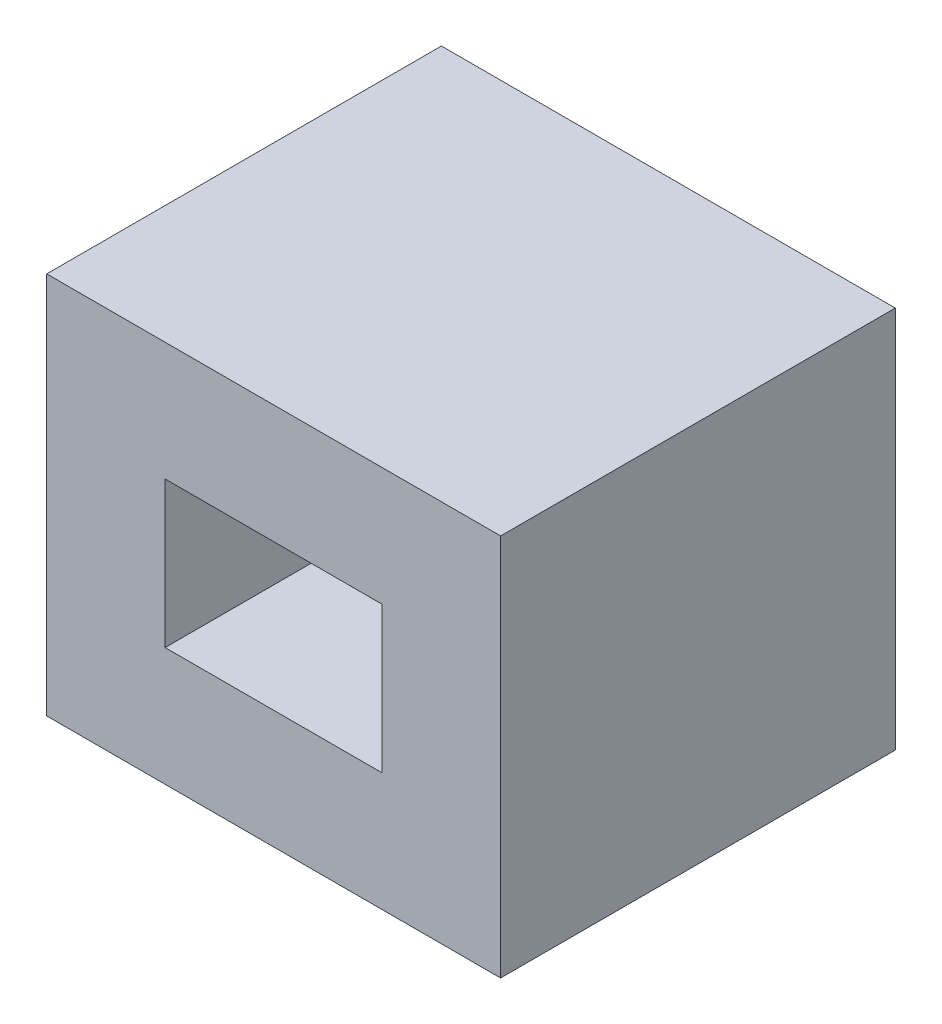
ISO-10303-21;
HEADER;
FILE_DESCRIPTION(('STEP AP214'),'2;1');
FILE_NAME('part.step','',(''),(''),'','','');
FILE_SCHEMA(('AUTOMOTIVE_DESIGN { 1 0 10303 214 1 1 1 1 }'));
ENDSEC;
DATA;
#1=APPLICATION_CONTEXT('core data for automotive mechanical design processes');
#2=APPLICATION_PROTOCOL_DEFINITION('international standard','automotive_design',2000,#1);
#3=PRODUCT_CONTEXT('',#1,'mechanical');
#4=PRODUCT('Part','Part','',(#3));
#5=PRODUCT_RELATED_PRODUCT_CATEGORY('part','',(#4));
#6=PRODUCT_DEFINITION_FORMATION('','',#4);
#7=PRODUCT_DEFINITION_CONTEXT('part definition',#1,'design');
#8=PRODUCT_DEFINITION('design','',#6,#7);
#9=PRODUCT_DEFINITION_SHAPE('','',#8);
#10=(LENGTH_UNIT() NAMED_UNIT(*) SI_UNIT(.MILLI.,.METRE.));
#11=(NAMED_UNIT(*) PLANE_ANGLE_UNIT() SI_UNIT($,.RADIAN.));
#12=(NAMED_UNIT(*) SI_UNIT($,.STERADIAN.) SOLID_ANGLE_UNIT());
#13=UNCERTAINTY_MEASURE_WITH_UNIT(LENGTH_MEASURE(1.E-05),#10,'distance_accuracy_value','');
#14=(GEOMETRIC_REPRESENTATION_CONTEXT(3) GLOBAL_UNCERTAINTY_ASSIGNED_CONTEXT((#13)) GLOBAL_UNIT_ASSIGNED_CONTEXT((#10,
#11,#12)) REPRESENTATION_CONTEXT('',''));
#15=CARTESIAN_POINT('',(0.,0.,0.));
#16=DIRECTION('',(0.,0.,1.));
#17=DIRECTION('',(1.,0.,0.));
#18=AXIS2_PLACEMENT_3D('',#15,#16,#17);
#19=CARTESIAN_POINT('',(0.,0.,10.));
#20=DIRECTION('',(0.,0.,1.));
#21=DIRECTION('',(1.,0.,0.));
#22=AXIS2_PLACEMENT_3D('',#19,#20,#21);
#23=PLANE('',#22);
#24=DIRECTION('',(0.,-1.,0.));
#25=VECTOR('',#24,1.);
#26=CARTESIAN_POINT('',(-5.75,4.85,10.));
#27=LINE('',#26,#25);
#28=CARTESIAN_POINT('',(-5.75,4.85,10.));
#29=VERTEX_POINT('',#28);
#30=CARTESIAN_POINT('',(-5.75,-4.85,10.));
#31=VERTEX_POINT('',#30);
#32=EDGE_CURVE('E134',#29,#31,#27,.T.);
#33=ORIENTED_EDGE('',*,*,#32,.T.);
#34=DIRECTION('',(1.,0.,0.));
#35=VECTOR('',#34,1.);
#36=CARTESIAN_POINT('',(-5.75,-4.85,10.));
#37=LINE('',#36,#35);
#38=CARTESIAN_POINT('',(5.75,-4.85,10.));
#39=VERTEX_POINT('',#38);
#40=EDGE_CURVE('E137',#31,#39,#37,.T.);
#41=ORIENTED_EDGE('',*,*,#40,.T.);
#42=DIRECTION('',(0.,1.,0.));
#43=VECTOR('',#42,1.);
#44=CARTESIAN_POINT('',(5.75,4.85,10.));
#45=LINE('',#44,#43);
#46=CARTESIAN_POINT('',(5.75,4.85,10.));
#47=VERTEX_POINT('',#46);
#48=EDGE_CURVE('E140',#39,#47,#45,.T.);
#49=ORIENTED_EDGE('',*,*,#48,.T.);
#50=DIRECTION('',(-1.,0.,0.));
#51=VECTOR('',#50,1.);
#52=CARTESIAN_POINT('',(-5.75,4.85,10.));
#53=LINE('',#52,#51);
#54=EDGE_CURVE('E142',#47,#29,#53,.T.);
#55=ORIENTED_EDGE('',*,*,#54,.T.);
#56=EDGE_LOOP('',(#33,#41,#49,#55));
#57=FACE_BOUND('',#56,.T.);
#58=DIRECTION('',(-1.,0.,0.));
#59=VECTOR('',#58,1.);
#60=CARTESIAN_POINT('',(2.75,1.85,10.));
#61=LINE('',#60,#59);
#62=CARTESIAN_POINT('',(2.75,1.85,10.));
#63=VERTEX_POINT('',#62);
#64=CARTESIAN_POINT('',(-2.75,1.85,10.));
#65=VERTEX_POINT('',#64);
#66=EDGE_CURVE('E106',#63,#65,#61,.T.);
#67=ORIENTED_EDGE('',*,*,#66,.F.);
#68=DIRECTION('',(0.,1.,0.));
#69=VECTOR('',#68,1.);
#70=CARTESIAN_POINT('',(2.75,-1.85,10.));
#71=LINE('',#70,#69);
#72=CARTESIAN_POINT('',(2.75,-1.85,10.));
#73=VERTEX_POINT('',#72);
#74=EDGE_CURVE('E98',#73,#63,#71,.T.);
#75=ORIENTED_EDGE('',*,*,#74,.F.);
#76=DIRECTION('',(1.,0.,0.));
#77=VECTOR('',#76,1.);
#78=CARTESIAN_POINT('',(2.75,-1.85,10.));
#79=LINE('',#78,#77);
#80=CARTESIAN_POINT('',(-2.75,-1.85,10.));
#81=VERTEX_POINT('',#80);
#82=EDGE_CURVE('E120',#81,#73,#79,.T.);
#83=ORIENTED_EDGE('',*,*,#82,.F.);
#84=DIRECTION('',(0.,-1.,0.));
#85=VECTOR('',#84,1.);
#86=CARTESIAN_POINT('',(-2.75,-1.85,10.));
#87=LINE('',#86,#85);
#88=EDGE_CURVE('E118',#65,#81,#87,.T.);
#89=ORIENTED_EDGE('',*,*,#88,.F.);
#90=EDGE_LOOP('',(#67,#75,#83,#89));
#91=FACE_BOUND('',#90,.T.);
#92=ADVANCED_FACE('F33',(#57,#91),#23,.T.);
#93=CARTESIAN_POINT('',(0.,0.,0.));
#94=DIRECTION('',(0.,0.,1.));
#95=DIRECTION('',(1.,0.,0.));
#96=AXIS2_PLACEMENT_3D('',#93,#94,#95);
#97=PLANE('',#96);
#98=DIRECTION('',(0.,-1.,0.));
#99=VECTOR('',#98,1.);
#100=CARTESIAN_POINT('',(-5.75,4.85,0.));
#101=LINE('',#100,#99);
#102=CARTESIAN_POINT('',(-5.75,4.85,0.));
#103=VERTEX_POINT('',#102);
#104=CARTESIAN_POINT('',(-5.75,-4.85,0.));
#105=VERTEX_POINT('',#104);
#106=EDGE_CURVE('E114',#103,#105,#101,.T.);
#107=ORIENTED_EDGE('',*,*,#106,.F.);
#108=DIRECTION('',(-1.,0.,0.));
#109=VECTOR('',#108,1.);
#110=CARTESIAN_POINT('',(-5.75,4.85,0.));
#111=LINE('',#110,#109);
#112=CARTESIAN_POINT('',(5.75,4.85,0.));
#113=VERTEX_POINT('',#112);
#114=EDGE_CURVE('E138',#113,#103,#111,.T.);
#115=ORIENTED_EDGE('',*,*,#114,.F.);
#116=DIRECTION('',(0.,1.,0.));
#117=VECTOR('',#116,1.);
#118=CARTESIAN_POINT('',(5.75,4.85,0.));
#119=LINE('',#118,#117);
#120=CARTESIAN_POINT('',(5.75,-4.85,0.));
#121=VERTEX_POINT('',#120);
#122=EDGE_CURVE('E149',#121,#113,#119,.T.);
#123=ORIENTED_EDGE('',*,*,#122,.F.);
#124=DIRECTION('',(1.,0.,0.));
#125=VECTOR('',#124,1.);
#126=CARTESIAN_POINT('',(-5.75,-4.85,0.));
#127=LINE('',#126,#125);
#128=EDGE_CURVE('E147',#105,#121,#127,.T.);
#129=ORIENTED_EDGE('',*,*,#128,.F.);
#130=EDGE_LOOP('',(#107,#115,#123,#129));
#131=FACE_BOUND('',#130,.T.);
#132=DIRECTION('',(0.,1.,0.));
#133=VECTOR('',#132,1.);
#134=CARTESIAN_POINT('',(2.75,-1.85,0.));
#135=LINE('',#134,#133);
#136=CARTESIAN_POINT('',(2.75,-1.85,0.));
#137=VERTEX_POINT('',#136);
#138=CARTESIAN_POINT('',(2.75,1.85,0.));
#139=VERTEX_POINT('',#138);
#140=EDGE_CURVE('E56',#137,#139,#135,.T.);
#141=ORIENTED_EDGE('',*,*,#140,.T.);
#142=DIRECTION('',(-1.,0.,0.));
#143=VECTOR('',#142,1.);
#144=CARTESIAN_POINT('',(2.75,1.85,0.));
#145=LINE('',#144,#143);
#146=CARTESIAN_POINT('',(-2.75,1.85,0.));
#147=VERTEX_POINT('',#146);
#148=EDGE_CURVE('E113',#139,#147,#145,.T.);
#149=ORIENTED_EDGE('',*,*,#148,.T.);
#150=DIRECTION('',(0.,-1.,0.));
#151=VECTOR('',#150,1.);
#152=CARTESIAN_POINT('',(-2.75,-1.85,0.));
#153=LINE('',#152,#151);
#154=CARTESIAN_POINT('',(-2.75,-1.85,0.));
#155=VERTEX_POINT('',#154);
#156=EDGE_CURVE('E126',#147,#155,#153,.T.);
#157=ORIENTED_EDGE('',*,*,#156,.T.);
#158=DIRECTION('',(1.,0.,0.));
#159=VECTOR('',#158,1.);
#160=CARTESIAN_POINT('',(2.75,-1.85,0.));
#161=LINE('',#160,#159);
#162=EDGE_CURVE('E107',#155,#137,#161,.T.);
#163=ORIENTED_EDGE('',*,*,#162,.T.);
#164=EDGE_LOOP('',(#141,#149,#157,#163));
#165=FACE_BOUND('',#164,.T.);
#166=ADVANCED_FACE('F167',(#131,#165),#97,.F.);
#167=CARTESIAN_POINT('',(-5.75,4.85,10.));
#168=DIRECTION('',(1.,0.,0.));
#169=DIRECTION('',(0.,0.,-1.));
#170=AXIS2_PLACEMENT_3D('',#167,#168,#169);
#171=PLANE('',#170);
#172=ORIENTED_EDGE('',*,*,#106,.T.);
#173=DIRECTION('',(0.,0.,-1.));
#174=VECTOR('',#173,1.);
#175=CARTESIAN_POINT('',(-5.75,-4.85,10.));
#176=LINE('',#175,#174);
#177=EDGE_CURVE('E11',#31,#105,#176,.T.);
#178=ORIENTED_EDGE('',*,*,#177,.F.);
#179=ORIENTED_EDGE('',*,*,#32,.F.);
#180=DIRECTION('',(0.,0.,-1.));
#181=VECTOR('',#180,1.);
#182=CARTESIAN_POINT('',(-5.75,4.85,10.));
#183=LINE('',#182,#181);
#184=EDGE_CURVE('E144',#29,#103,#183,.T.);
#185=ORIENTED_EDGE('',*,*,#184,.T.);
#186=EDGE_LOOP('',(#172,#178,#179,#185));
#187=FACE_BOUND('',#186,.T.);
#188=ADVANCED_FACE('F35',(#187),#171,.F.);
#189=CARTESIAN_POINT('',(-5.75,-4.85,10.));
#190=DIRECTION('',(0.,1.,0.));
#191=DIRECTION('',(0.,0.,1.));
#192=AXIS2_PLACEMENT_3D('',#189,#190,#191);
#193=PLANE('',#192);
#194=ORIENTED_EDGE('',*,*,#128,.T.);
#195=DIRECTION('',(0.,0.,-1.));
#196=VECTOR('',#195,1.);
#197=CARTESIAN_POINT('',(5.75,-4.85,10.));
#198=LINE('',#197,#196);
#199=EDGE_CURVE('E41',#39,#121,#198,.T.);
#200=ORIENTED_EDGE('',*,*,#199,.F.);
#201=ORIENTED_EDGE('',*,*,#40,.F.);
#202=ORIENTED_EDGE('',*,*,#177,.T.);
#203=EDGE_LOOP('',(#194,#200,#201,#202));
#204=FACE_BOUND('',#203,.T.);
#205=ADVANCED_FACE('F177',(#204),#193,.F.);
#206=CARTESIAN_POINT('',(5.75,4.85,10.));
#207=DIRECTION('',(-1.,0.,0.));
#208=DIRECTION('',(0.,0.,1.));
#209=AXIS2_PLACEMENT_3D('',#206,#207,#208);
#210=PLANE('',#209);
#211=ORIENTED_EDGE('',*,*,#122,.T.);
#212=DIRECTION('',(0.,0.,-1.));
#213=VECTOR('',#212,1.);
#214=CARTESIAN_POINT('',(5.75,4.85,10.));
#215=LINE('',#214,#213);
#216=EDGE_CURVE('E154',#47,#113,#215,.T.);
#217=ORIENTED_EDGE('',*,*,#216,.F.);
#218=ORIENTED_EDGE('',*,*,#48,.F.);
#219=ORIENTED_EDGE('',*,*,#199,.T.);
#220=EDGE_LOOP('',(#211,#217,#218,#219));
#221=FACE_BOUND('',#220,.T.);
#222=ADVANCED_FACE('F161',(#221),#210,.F.);
#223=CARTESIAN_POINT('',(-5.75,4.85,10.));
#224=DIRECTION('',(0.,-1.,0.));
#225=DIRECTION('',(0.,0.,-1.));
#226=AXIS2_PLACEMENT_3D('',#223,#224,#225);
#227=PLANE('',#226);
#228=ORIENTED_EDGE('',*,*,#114,.T.);
#229=ORIENTED_EDGE('',*,*,#184,.F.);
#230=ORIENTED_EDGE('',*,*,#54,.F.);
#231=ORIENTED_EDGE('',*,*,#216,.T.);
#232=EDGE_LOOP('',(#228,#229,#230,#231));
#233=FACE_BOUND('',#232,.T.);
#234=ADVANCED_FACE('F171',(#233),#227,.F.);
#235=CARTESIAN_POINT('',(2.75,-1.85,10.));
#236=DIRECTION('',(-1.,0.,0.));
#237=DIRECTION('',(0.,0.,1.));
#238=AXIS2_PLACEMENT_3D('',#235,#236,#237);
#239=PLANE('',#238);
#240=ORIENTED_EDGE('',*,*,#140,.F.);
#241=DIRECTION('',(0.,0.,-1.));
#242=VECTOR('',#241,1.);
#243=CARTESIAN_POINT('',(2.75,-1.85,10.));
#244=LINE('',#243,#242);
#245=EDGE_CURVE('E102',#73,#137,#244,.T.);
#246=ORIENTED_EDGE('',*,*,#245,.F.);
#247=ORIENTED_EDGE('',*,*,#74,.T.);
#248=DIRECTION('',(0.,0.,-1.));
#249=VECTOR('',#248,1.);
#250=CARTESIAN_POINT('',(2.75,1.85,10.));
#251=LINE('',#250,#249);
#252=EDGE_CURVE('E101',#63,#139,#251,.T.);
#253=ORIENTED_EDGE('',*,*,#252,.T.);
#254=EDGE_LOOP('',(#240,#246,#247,#253));
#255=FACE_BOUND('',#254,.T.);
#256=ADVANCED_FACE('F100',(#255),#239,.T.);
#257=CARTESIAN_POINT('',(2.75,1.85,10.));
#258=DIRECTION('',(0.,-1.,0.));
#259=DIRECTION('',(0.,0.,-1.));
#260=AXIS2_PLACEMENT_3D('',#257,#258,#259);
#261=PLANE('',#260);
#262=ORIENTED_EDGE('',*,*,#148,.F.);
#263=ORIENTED_EDGE('',*,*,#252,.F.);
#264=ORIENTED_EDGE('',*,*,#66,.T.);
#265=DIRECTION('',(0.,0.,-1.));
#266=VECTOR('',#265,1.);
#267=CARTESIAN_POINT('',(-2.75,1.85,10.));
#268=LINE('',#267,#266);
#269=EDGE_CURVE('E115',#65,#147,#268,.T.);
#270=ORIENTED_EDGE('',*,*,#269,.T.);
#271=EDGE_LOOP('',(#262,#263,#264,#270));
#272=FACE_BOUND('',#271,.T.);
#273=ADVANCED_FACE('F110',(#272),#261,.T.);
#274=CARTESIAN_POINT('',(-2.75,-1.85,10.));
#275=DIRECTION('',(1.,0.,0.));
#276=DIRECTION('',(0.,0.,-1.));
#277=AXIS2_PLACEMENT_3D('',#274,#275,#276);
#278=PLANE('',#277);
#279=ORIENTED_EDGE('',*,*,#156,.F.);
#280=ORIENTED_EDGE('',*,*,#269,.F.);
#281=ORIENTED_EDGE('',*,*,#88,.T.);
#282=DIRECTION('',(0.,0.,-1.));
#283=VECTOR('',#282,1.);
#284=CARTESIAN_POINT('',(-2.75,-1.85,10.));
#285=LINE('',#284,#283);
#286=EDGE_CURVE('E48',#81,#155,#285,.T.);
#287=ORIENTED_EDGE('',*,*,#286,.T.);
#288=EDGE_LOOP('',(#279,#280,#281,#287));
#289=FACE_BOUND('',#288,.T.);
#290=ADVANCED_FACE('F200',(#289),#278,.T.);
#291=CARTESIAN_POINT('',(2.75,-1.85,10.));
#292=DIRECTION('',(0.,1.,0.));
#293=DIRECTION('',(0.,0.,1.));
#294=AXIS2_PLACEMENT_3D('',#291,#292,#293);
#295=PLANE('',#294);
#296=ORIENTED_EDGE('',*,*,#162,.F.);
#297=ORIENTED_EDGE('',*,*,#286,.F.);
#298=ORIENTED_EDGE('',*,*,#82,.T.);
#299=ORIENTED_EDGE('',*,*,#245,.T.);
#300=EDGE_LOOP('',(#296,#297,#298,#299));
#301=FACE_BOUND('',#300,.T.);
#302=ADVANCED_FACE('F204',(#301),#295,.T.);
#303=CLOSED_SHELL('',(#92,#166,#188,#205,#222,#234,#256,#273,#290,#302));
#304=MANIFOLD_SOLID_BREP('B2',#303);
#305=ADVANCED_BREP_SHAPE_REPRESENTATION('',(#18,#304),#14);
#306=SHAPE_DEFINITION_REPRESENTATION(#9,#305);
ENDSEC;
END-ISO-10303-21;
